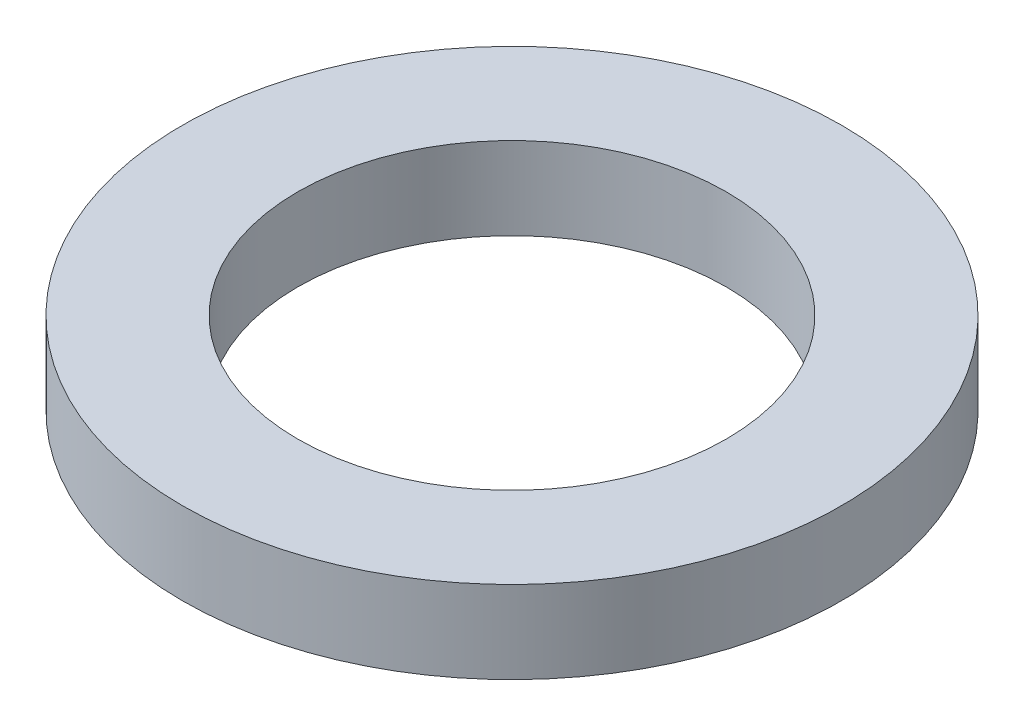
ISO-10303-21;
HEADER;
FILE_DESCRIPTION(('STEP AP214'),'2;1');
FILE_NAME('part.step','',(''),(''),'','','');
FILE_SCHEMA(('AUTOMOTIVE_DESIGN { 1 0 10303 214 1 1 1 1 }'));
ENDSEC;
DATA;
#1=APPLICATION_CONTEXT('core data for automotive mechanical design processes');
#2=APPLICATION_PROTOCOL_DEFINITION('international standard','automotive_design',2000,#1);
#3=PRODUCT_CONTEXT('',#1,'mechanical');
#4=PRODUCT('Part','Part','',(#3));
#5=PRODUCT_RELATED_PRODUCT_CATEGORY('part','',(#4));
#6=PRODUCT_DEFINITION_FORMATION('','',#4);
#7=PRODUCT_DEFINITION_CONTEXT('part definition',#1,'design');
#8=PRODUCT_DEFINITION('design','',#6,#7);
#9=PRODUCT_DEFINITION_SHAPE('','',#8);
#10=(LENGTH_UNIT() NAMED_UNIT(*) SI_UNIT(.MILLI.,.METRE.));
#11=(NAMED_UNIT(*) PLANE_ANGLE_UNIT() SI_UNIT($,.RADIAN.));
#12=(NAMED_UNIT(*) SI_UNIT($,.STERADIAN.) SOLID_ANGLE_UNIT());
#13=UNCERTAINTY_MEASURE_WITH_UNIT(LENGTH_MEASURE(1.E-05),#10,'distance_accuracy_value','');
#14=(GEOMETRIC_REPRESENTATION_CONTEXT(3) GLOBAL_UNCERTAINTY_ASSIGNED_CONTEXT((#13)) GLOBAL_UNIT_ASSIGNED_CONTEXT((#10,
#11,#12)) REPRESENTATION_CONTEXT('',''));
#15=CARTESIAN_POINT('',(0.,0.,0.));
#16=DIRECTION('',(0.,0.,1.));
#17=DIRECTION('',(1.,0.,0.));
#18=AXIS2_PLACEMENT_3D('',#15,#16,#17);
#19=CARTESIAN_POINT('',(0.,5.,0.));
#20=DIRECTION('',(0.,1.,0.));
#21=DIRECTION('',(0.,0.,1.));
#22=AXIS2_PLACEMENT_3D('',#19,#20,#21);
#23=PLANE('',#22);
#24=CARTESIAN_POINT('',(0.,5.,0.));
#25=DIRECTION('',(0.,1.,0.));
#26=DIRECTION('',(0.,0.,1.));
#27=AXIS2_PLACEMENT_3D('',#24,#25,#26);
#28=CIRCLE('',#27,20.);
#29=CARTESIAN_POINT('',(0.,5.,20.));
#30=VERTEX_POINT('',#29);
#31=EDGE_CURVE('E10',#30,#30,#28,.T.);
#32=ORIENTED_EDGE('',*,*,#31,.T.);
#33=EDGE_LOOP('',(#32));
#34=FACE_BOUND('',#33,.T.);
#35=CARTESIAN_POINT('',(0.,5.,0.));
#36=DIRECTION('',(0.,1.,0.));
#37=DIRECTION('',(0.,0.,1.));
#38=AXIS2_PLACEMENT_3D('',#35,#36,#37);
#39=CIRCLE('',#38,13.);
#40=CARTESIAN_POINT('',(0.,5.,13.));
#41=VERTEX_POINT('',#40);
#42=EDGE_CURVE('E43',#41,#41,#39,.T.);
#43=ORIENTED_EDGE('',*,*,#42,.F.);
#44=EDGE_LOOP('',(#43));
#45=FACE_BOUND('',#44,.T.);
#46=ADVANCED_FACE('F32',(#34,#45),#23,.T.);
#47=CARTESIAN_POINT('',(0.,0.,0.));
#48=DIRECTION('',(0.,1.,0.));
#49=DIRECTION('',(0.,0.,1.));
#50=AXIS2_PLACEMENT_3D('',#47,#48,#49);
#51=PLANE('',#50);
#52=CARTESIAN_POINT('',(0.,0.,0.));
#53=DIRECTION('',(0.,1.,0.));
#54=DIRECTION('',(0.,0.,1.));
#55=AXIS2_PLACEMENT_3D('',#52,#53,#54);
#56=CIRCLE('',#55,20.);
#57=CARTESIAN_POINT('',(0.,0.,20.));
#58=VERTEX_POINT('',#57);
#59=EDGE_CURVE('E36',#58,#58,#56,.T.);
#60=ORIENTED_EDGE('',*,*,#59,.F.);
#61=EDGE_LOOP('',(#60));
#62=FACE_BOUND('',#61,.T.);
#63=CARTESIAN_POINT('',(0.,0.,0.));
#64=DIRECTION('',(0.,1.,0.));
#65=DIRECTION('',(0.,0.,1.));
#66=AXIS2_PLACEMENT_3D('',#63,#64,#65);
#67=CIRCLE('',#66,13.);
#68=CARTESIAN_POINT('',(0.,0.,13.));
#69=VERTEX_POINT('',#68);
#70=EDGE_CURVE('E45',#69,#69,#67,.T.);
#71=ORIENTED_EDGE('',*,*,#70,.T.);
#72=EDGE_LOOP('',(#71));
#73=FACE_BOUND('',#72,.T.);
#74=ADVANCED_FACE('F55',(#62,#73),#51,.F.);
#75=CARTESIAN_POINT('',(0.,5.,0.));
#76=DIRECTION('',(0.,-1.,0.));
#77=DIRECTION('',(0.,0.,-1.));
#78=AXIS2_PLACEMENT_3D('',#75,#76,#77);
#79=CYLINDRICAL_SURFACE('',#78,20.);
#80=ORIENTED_EDGE('',*,*,#31,.F.);
#81=EDGE_LOOP('',(#80));
#82=FACE_BOUND('',#81,.T.);
#83=ORIENTED_EDGE('',*,*,#59,.T.);
#84=EDGE_LOOP('',(#83));
#85=FACE_BOUND('',#84,.T.);
#86=ADVANCED_FACE('F34',(#82,#85),#79,.T.);
#87=CARTESIAN_POINT('',(0.,5.,0.));
#88=DIRECTION('',(0.,-1.,0.));
#89=DIRECTION('',(0.,0.,-1.));
#90=AXIS2_PLACEMENT_3D('',#87,#88,#89);
#91=CYLINDRICAL_SURFACE('',#90,13.);
#92=ORIENTED_EDGE('',*,*,#42,.T.);
#93=EDGE_LOOP('',(#92));
#94=FACE_BOUND('',#93,.T.);
#95=ORIENTED_EDGE('',*,*,#70,.F.);
#96=EDGE_LOOP('',(#95));
#97=FACE_BOUND('',#96,.T.);
#98=ADVANCED_FACE('F51',(#94,#97),#91,.F.);
#99=CLOSED_SHELL('',(#46,#74,#86,#98));
#100=MANIFOLD_SOLID_BREP('B2',#99);
#101=ADVANCED_BREP_SHAPE_REPRESENTATION('',(#18,#100),#14);
#102=SHAPE_DEFINITION_REPRESENTATION(#9,#101);
ENDSEC;
END-ISO-10303-21;
